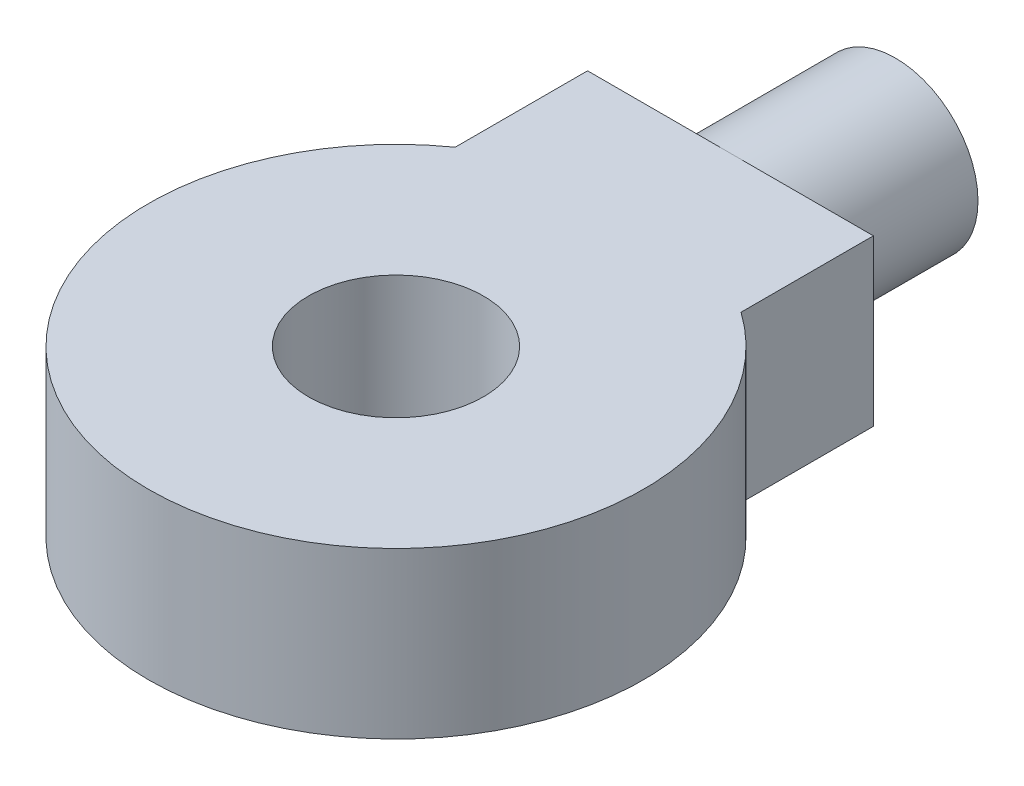
ISO-10303-21;
HEADER;
FILE_DESCRIPTION(('STEP AP214'),'2;1');
FILE_NAME('part.step','',(''),(''),'','','');
FILE_SCHEMA(('AUTOMOTIVE_DESIGN { 1 0 10303 214 1 1 1 1 }'));
ENDSEC;
DATA;
#1=APPLICATION_CONTEXT('core data for automotive mechanical design processes');
#2=APPLICATION_PROTOCOL_DEFINITION('international standard','automotive_design',2000,#1);
#3=PRODUCT_CONTEXT('',#1,'mechanical');
#4=PRODUCT('Part','Part','',(#3));
#5=PRODUCT_RELATED_PRODUCT_CATEGORY('part','',(#4));
#6=PRODUCT_DEFINITION_FORMATION('','',#4);
#7=PRODUCT_DEFINITION_CONTEXT('part definition',#1,'design');
#8=PRODUCT_DEFINITION('design','',#6,#7);
#9=PRODUCT_DEFINITION_SHAPE('','',#8);
#10=(LENGTH_UNIT() NAMED_UNIT(*) SI_UNIT(.MILLI.,.METRE.));
#11=(NAMED_UNIT(*) PLANE_ANGLE_UNIT() SI_UNIT($,.RADIAN.));
#12=(NAMED_UNIT(*) SI_UNIT($,.STERADIAN.) SOLID_ANGLE_UNIT());
#13=UNCERTAINTY_MEASURE_WITH_UNIT(LENGTH_MEASURE(1.E-05),#10,'distance_accuracy_value','');
#14=(GEOMETRIC_REPRESENTATION_CONTEXT(3) GLOBAL_UNCERTAINTY_ASSIGNED_CONTEXT((#13)) GLOBAL_UNIT_ASSIGNED_CONTEXT((#10,
#11,#12)) REPRESENTATION_CONTEXT('',''));
#15=CARTESIAN_POINT('',(0.,0.,0.));
#16=DIRECTION('',(0.,0.,1.));
#17=DIRECTION('',(1.,0.,0.));
#18=AXIS2_PLACEMENT_3D('',#15,#16,#17);
#19=CARTESIAN_POINT('',(0.00480947161671241,-0.00484590396801488,-15.1338153233316));
#20=DIRECTION('',(0.,0.,1.));
#21=DIRECTION('',(1.,0.,0.));
#22=AXIS2_PLACEMENT_3D('',#19,#20,#21);
#23=CYLINDRICAL_SURFACE('',#22,2.5);
#24=CARTESIAN_POINT('',(0.00480947161671241,-0.00484590396801488,-15.1338153233316));
#25=DIRECTION('',(0.,0.,1.));
#26=DIRECTION('',(1.,0.,0.));
#27=AXIS2_PLACEMENT_3D('',#24,#25,#26);
#28=CIRCLE('',#27,2.5);
#29=CARTESIAN_POINT('',(2.50480947161671,-0.00484590396801488,-15.1338153233316));
#30=VERTEX_POINT('',#29);
#31=EDGE_CURVE('E11',#30,#30,#28,.T.);
#32=ORIENTED_EDGE('',*,*,#31,.T.);
#33=EDGE_LOOP('',(#32));
#34=FACE_BOUND('',#33,.T.);
#35=CARTESIAN_POINT('',(0.00480947161671241,-0.00484590396801488,-10.1338153233316));
#36=DIRECTION('',(0.,0.,1.));
#37=DIRECTION('',(1.,0.,0.));
#38=AXIS2_PLACEMENT_3D('',#35,#36,#37);
#39=CIRCLE('',#38,2.5);
#40=CARTESIAN_POINT('',(0.00480947161671241,2.49515409603199,-10.1338153233316));
#41=VERTEX_POINT('',#40);
#42=CARTESIAN_POINT('',(0.00480947161671241,-2.50484590396802,-10.1338153233316));
#43=VERTEX_POINT('',#42);
#44=EDGE_CURVE('E42',#41,#43,#39,.T.);
#45=ORIENTED_EDGE('',*,*,#44,.F.);
#46=EDGE_CURVE('E93',#43,#41,#39,.T.);
#47=ORIENTED_EDGE('',*,*,#46,.F.);
#48=EDGE_LOOP('',(#45,#47));
#49=FACE_BOUND('',#48,.T.);
#50=ADVANCED_FACE('F39',(#34,#49),#23,.T.);
#51=CARTESIAN_POINT('',(0.00480947161671241,-0.00484590396801488,-15.1338153233316));
#52=DIRECTION('',(0.,0.,1.));
#53=DIRECTION('',(1.,0.,0.));
#54=AXIS2_PLACEMENT_3D('',#51,#52,#53);
#55=PLANE('',#54);
#56=ORIENTED_EDGE('',*,*,#31,.F.);
#57=EDGE_LOOP('',(#56));
#58=FACE_BOUND('',#57,.T.);
#59=ADVANCED_FACE('F178',(#58),#55,.F.);
#60=CARTESIAN_POINT('',(-21.,-129.32,-10.1338153233316));
#61=DIRECTION('',(0.,0.,1.));
#62=DIRECTION('',(1.,0.,0.));
#63=AXIS2_PLACEMENT_3D('',#60,#61,#62);
#64=PLANE('',#63);
#65=DIRECTION('',(-1.,0.,0.));
#66=VECTOR('',#65,1.);
#67=CARTESIAN_POINT('',(-4.32531754730548,2.49515409603199,-10.1338153233316));
#68=LINE('',#67,#66);
#69=CARTESIAN_POINT('',(-4.32531754730548,2.49515409603199,-10.1338153233316));
#70=VERTEX_POINT('',#69);
#71=EDGE_CURVE('E122',#41,#70,#68,.T.);
#72=ORIENTED_EDGE('',*,*,#71,.F.);
#73=ORIENTED_EDGE('',*,*,#44,.T.);
#74=DIRECTION('',(1.,0.,0.));
#75=VECTOR('',#74,1.);
#76=CARTESIAN_POINT('',(-4.32531754730548,-2.50484590396802,-10.1338153233316));
#77=LINE('',#76,#75);
#78=CARTESIAN_POINT('',(-4.32531754730548,-2.50484590396802,-10.1338153233316));
#79=VERTEX_POINT('',#78);
#80=EDGE_CURVE('E89',#79,#43,#77,.T.);
#81=ORIENTED_EDGE('',*,*,#80,.F.);
#82=DIRECTION('',(0.,-1.,0.));
#83=VECTOR('',#82,1.);
#84=CARTESIAN_POINT('',(-4.32531754730548,2.49515409603199,-10.1338153233316));
#85=LINE('',#84,#83);
#86=EDGE_CURVE('E101',#70,#79,#85,.T.);
#87=ORIENTED_EDGE('',*,*,#86,.F.);
#88=EDGE_LOOP('',(#72,#73,#81,#87));
#89=FACE_BOUND('',#88,.T.);
#90=ADVANCED_FACE('F100',(#89),#64,.F.);
#91=CARTESIAN_POINT('',(4.33493649053891,-2.50484590396802,-10.1338153233316));
#92=VERTEX_POINT('',#91);
#93=EDGE_CURVE('E105',#43,#92,#77,.T.);
#94=ORIENTED_EDGE('',*,*,#93,.F.);
#95=ORIENTED_EDGE('',*,*,#46,.T.);
#96=CARTESIAN_POINT('',(4.33493649053891,2.49515409603199,-10.1338153233316));
#97=VERTEX_POINT('',#96);
#98=EDGE_CURVE('E123',#97,#41,#68,.T.);
#99=ORIENTED_EDGE('',*,*,#98,.F.);
#100=DIRECTION('',(0.,1.,0.));
#101=VECTOR('',#100,1.);
#102=CARTESIAN_POINT('',(4.33493649053891,2.49515409603199,-10.1338153233316));
#103=LINE('',#102,#101);
#104=EDGE_CURVE('E104',#92,#97,#103,.T.);
#105=ORIENTED_EDGE('',*,*,#104,.F.);
#106=EDGE_LOOP('',(#94,#95,#99,#105));
#107=FACE_BOUND('',#106,.T.);
#108=ADVANCED_FACE('F138',(#107),#64,.F.);
#109=CARTESIAN_POINT('',(-4.32531754730548,2.49515409603199,0.866184676668382));
#110=DIRECTION('',(1.,0.,0.));
#111=DIRECTION('',(0.,0.,-1.));
#112=AXIS2_PLACEMENT_3D('',#109,#110,#111);
#113=PLANE('',#112);
#114=DIRECTION('',(0.,0.,-1.));
#115=VECTOR('',#114,1.);
#116=CARTESIAN_POINT('',(-4.32531754730548,-2.50484590396802,0.866184676668382));
#117=LINE('',#116,#115);
#118=CARTESIAN_POINT('',(-4.32531754730548,-2.50484590396802,-6.12365941613678));
#119=VERTEX_POINT('',#118);
#120=EDGE_CURVE('E54',#119,#79,#117,.T.);
#121=ORIENTED_EDGE('',*,*,#120,.F.);
#122=DIRECTION('',(0.,1.,0.));
#123=VECTOR('',#122,1.);
#124=CARTESIAN_POINT('',(-4.32531754730548,-23.7180493395645,-6.12365941613678));
#125=LINE('',#124,#123);
#126=CARTESIAN_POINT('',(-4.32531754730548,2.49515409603199,-6.12365941613678));
#127=VERTEX_POINT('',#126);
#128=EDGE_CURVE('E112',#119,#127,#125,.T.);
#129=ORIENTED_EDGE('',*,*,#128,.T.);
#130=DIRECTION('',(0.,0.,-1.));
#131=VECTOR('',#130,1.);
#132=CARTESIAN_POINT('',(-4.32531754730548,2.49515409603199,0.866184676668382));
#133=LINE('',#132,#131);
#134=EDGE_CURVE('E109',#127,#70,#133,.T.);
#135=ORIENTED_EDGE('',*,*,#134,.T.);
#136=ORIENTED_EDGE('',*,*,#86,.T.);
#137=EDGE_LOOP('',(#121,#129,#135,#136));
#138=FACE_BOUND('',#137,.T.);
#139=ADVANCED_FACE('F107',(#138),#113,.F.);
#140=CARTESIAN_POINT('',(-4.32531754730548,-2.50484590396802,0.866184676668382));
#141=DIRECTION('',(0.,1.,0.));
#142=DIRECTION('',(0.,0.,1.));
#143=AXIS2_PLACEMENT_3D('',#140,#141,#142);
#144=PLANE('',#143);
#145=CARTESIAN_POINT('',(0.00480947161671241,-2.50484590396802,6.49408211615687E-05));
#146=DIRECTION('',(0.,1.,0.));
#147=DIRECTION('',(0.,0.,1.));
#148=AXIS2_PLACEMENT_3D('',#145,#146,#147);
#149=CIRCLE('',#148,2.65);
#150=CARTESIAN_POINT('',(0.00480947161671241,-2.50484590396802,2.65006494082116));
#151=VERTEX_POINT('',#150);
#152=EDGE_CURVE('E152',#151,#151,#149,.T.);
#153=ORIENTED_EDGE('',*,*,#152,.T.);
#154=EDGE_LOOP('',(#153));
#155=FACE_BOUND('',#154,.T.);
#156=CARTESIAN_POINT('',(0.00480947161671241,-2.50484590396802,6.49408211615687E-05));
#157=DIRECTION('',(0.,1.,0.));
#158=DIRECTION('',(0.,0.,1.));
#159=AXIS2_PLACEMENT_3D('',#156,#157,#158);
#160=CIRCLE('',#159,7.5);
#161=CARTESIAN_POINT('',(4.33493649053891,-2.50484590396802,-6.12365941613678));
#162=VERTEX_POINT('',#161);
#163=EDGE_CURVE('E91',#162,#119,#160,.F.);
#164=ORIENTED_EDGE('',*,*,#163,.T.);
#165=ORIENTED_EDGE('',*,*,#120,.T.);
#166=ORIENTED_EDGE('',*,*,#80,.T.);
#167=ORIENTED_EDGE('',*,*,#93,.T.);
#168=DIRECTION('',(0.,0.,-1.));
#169=VECTOR('',#168,1.);
#170=CARTESIAN_POINT('',(4.33493649053891,-2.50484590396802,0.866184676668382));
#171=LINE('',#170,#169);
#172=EDGE_CURVE('E94',#162,#92,#171,.T.);
#173=ORIENTED_EDGE('',*,*,#172,.F.);
#174=EDGE_LOOP('',(#164,#165,#166,#167,#173));
#175=FACE_BOUND('',#174,.T.);
#176=ADVANCED_FACE('F87',(#155,#175),#144,.F.);
#177=CARTESIAN_POINT('',(4.33493649053891,2.49515409603199,0.866184676668382));
#178=DIRECTION('',(-1.,0.,0.));
#179=DIRECTION('',(0.,0.,1.));
#180=AXIS2_PLACEMENT_3D('',#177,#178,#179);
#181=PLANE('',#180);
#182=DIRECTION('',(0.,0.,-1.));
#183=VECTOR('',#182,1.);
#184=CARTESIAN_POINT('',(4.33493649053891,2.49515409603199,0.866184676668382));
#185=LINE('',#184,#183);
#186=CARTESIAN_POINT('',(4.33493649053891,2.49515409603199,-6.12365941613678));
#187=VERTEX_POINT('',#186);
#188=EDGE_CURVE('E129',#187,#97,#185,.T.);
#189=ORIENTED_EDGE('',*,*,#188,.F.);
#190=DIRECTION('',(0.,1.,0.));
#191=VECTOR('',#190,1.);
#192=CARTESIAN_POINT('',(4.33493649053891,-23.7180493395645,-6.12365941613678));
#193=LINE('',#192,#191);
#194=EDGE_CURVE('E62',#187,#162,#193,.F.);
#195=ORIENTED_EDGE('',*,*,#194,.T.);
#196=ORIENTED_EDGE('',*,*,#172,.T.);
#197=ORIENTED_EDGE('',*,*,#104,.T.);
#198=EDGE_LOOP('',(#189,#195,#196,#197));
#199=FACE_BOUND('',#198,.T.);
#200=ADVANCED_FACE('F133',(#199),#181,.F.);
#201=CARTESIAN_POINT('',(-4.32531754730548,2.49515409603199,0.866184676668382));
#202=DIRECTION('',(0.,-1.,0.));
#203=DIRECTION('',(0.,0.,-1.));
#204=AXIS2_PLACEMENT_3D('',#201,#202,#203);
#205=PLANE('',#204);
#206=CARTESIAN_POINT('',(0.00480947161671241,2.49515409603199,6.49408211615687E-05));
#207=DIRECTION('',(0.,1.,0.));
#208=DIRECTION('',(0.,0.,1.));
#209=AXIS2_PLACEMENT_3D('',#206,#207,#208);
#210=CIRCLE('',#209,2.65);
#211=CARTESIAN_POINT('',(0.00480947161671241,2.49515409603199,2.65006494082116));
#212=VERTEX_POINT('',#211);
#213=EDGE_CURVE('E153',#212,#212,#210,.T.);
#214=ORIENTED_EDGE('',*,*,#213,.F.);
#215=EDGE_LOOP('',(#214));
#216=FACE_BOUND('',#215,.T.);
#217=ORIENTED_EDGE('',*,*,#134,.F.);
#218=CARTESIAN_POINT('',(0.00480947161671241,2.49515409603199,6.49408211615687E-05));
#219=DIRECTION('',(0.,1.,0.));
#220=DIRECTION('',(0.,0.,1.));
#221=AXIS2_PLACEMENT_3D('',#218,#219,#220);
#222=CIRCLE('',#221,7.5);
#223=EDGE_CURVE('E143',#127,#187,#222,.T.);
#224=ORIENTED_EDGE('',*,*,#223,.T.);
#225=ORIENTED_EDGE('',*,*,#188,.T.);
#226=ORIENTED_EDGE('',*,*,#98,.T.);
#227=ORIENTED_EDGE('',*,*,#71,.T.);
#228=EDGE_LOOP('',(#217,#224,#225,#226,#227));
#229=FACE_BOUND('',#228,.T.);
#230=ADVANCED_FACE('F140',(#216,#229),#205,.F.);
#231=CARTESIAN_POINT('',(0.00480947161671241,-23.7180493395645,6.49408211615687E-05));
#232=DIRECTION('',(0.,1.,0.));
#233=DIRECTION('',(0.,0.,1.));
#234=AXIS2_PLACEMENT_3D('',#231,#232,#233);
#235=CYLINDRICAL_SURFACE('',#234,7.5);
#236=ORIENTED_EDGE('',*,*,#128,.F.);
#237=ORIENTED_EDGE('',*,*,#163,.F.);
#238=ORIENTED_EDGE('',*,*,#194,.F.);
#239=ORIENTED_EDGE('',*,*,#223,.F.);
#240=EDGE_LOOP('',(#236,#237,#238,#239));
#241=FACE_BOUND('',#240,.T.);
#242=ADVANCED_FACE('F145',(#241),#235,.T.);
#243=CARTESIAN_POINT('',(0.00480947161671241,-2.50484590396802,6.49408211615687E-05));
#244=DIRECTION('',(0.,1.,0.));
#245=DIRECTION('',(0.,0.,1.));
#246=AXIS2_PLACEMENT_3D('',#243,#244,#245);
#247=CYLINDRICAL_SURFACE('',#246,2.65);
#248=ORIENTED_EDGE('',*,*,#152,.F.);
#249=EDGE_LOOP('',(#248));
#250=FACE_BOUND('',#249,.T.);
#251=ORIENTED_EDGE('',*,*,#213,.T.);
#252=EDGE_LOOP('',(#251));
#253=FACE_BOUND('',#252,.T.);
#254=ADVANCED_FACE('F162',(#250,#253),#247,.F.);
#255=CLOSED_SHELL('',(#50,#59,#90,#108,#139,#176,#200,#230,#242,#254));
#256=MANIFOLD_SOLID_BREP('B2',#255);
#257=ADVANCED_BREP_SHAPE_REPRESENTATION('',(#18,#256),#14);
#258=SHAPE_DEFINITION_REPRESENTATION(#9,#257);
ENDSEC;
END-ISO-10303-21;
